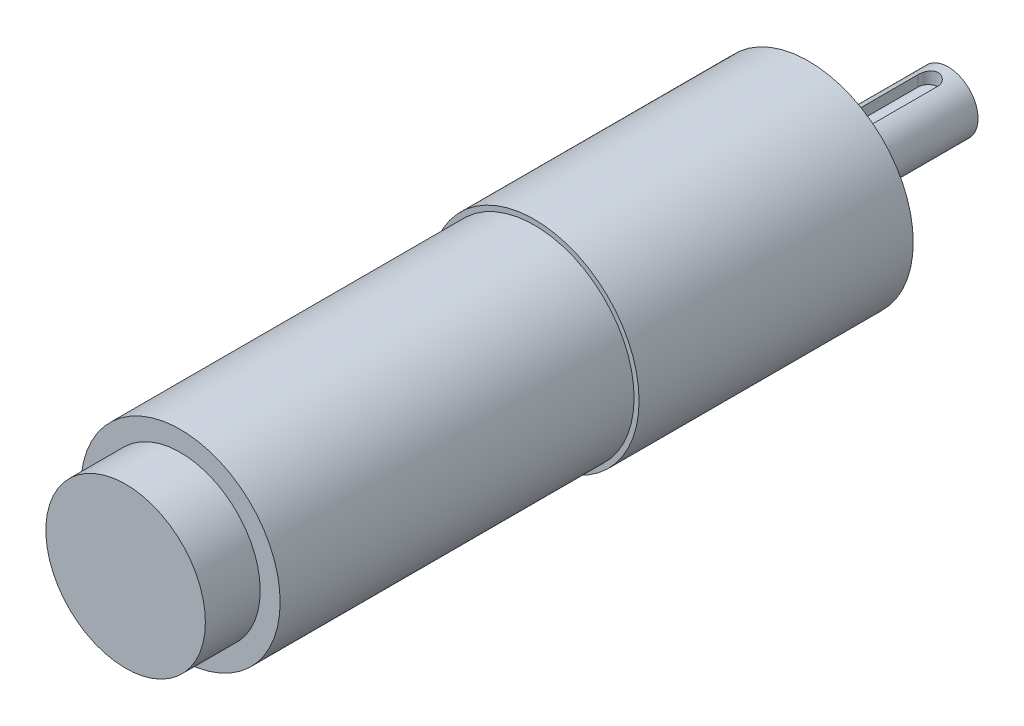
ISO-10303-21;
HEADER;
FILE_DESCRIPTION(('STEP AP214'),'2;1');
FILE_NAME('part.step','',(''),(''),'','','');
FILE_SCHEMA(('AUTOMOTIVE_DESIGN { 1 0 10303 214 1 1 1 1 }'));
ENDSEC;
DATA;
#1=APPLICATION_CONTEXT('core data for automotive mechanical design processes');
#2=APPLICATION_PROTOCOL_DEFINITION('international standard','automotive_design',2000,#1);
#3=PRODUCT_CONTEXT('',#1,'mechanical');
#4=PRODUCT('Part','Part','',(#3));
#5=PRODUCT_RELATED_PRODUCT_CATEGORY('part','',(#4));
#6=PRODUCT_DEFINITION_FORMATION('','',#4);
#7=PRODUCT_DEFINITION_CONTEXT('part definition',#1,'design');
#8=PRODUCT_DEFINITION('design','',#6,#7);
#9=PRODUCT_DEFINITION_SHAPE('','',#8);
#10=(LENGTH_UNIT() NAMED_UNIT(*) SI_UNIT(.MILLI.,.METRE.));
#11=(NAMED_UNIT(*) PLANE_ANGLE_UNIT() SI_UNIT($,.RADIAN.));
#12=(NAMED_UNIT(*) SI_UNIT($,.STERADIAN.) SOLID_ANGLE_UNIT());
#13=UNCERTAINTY_MEASURE_WITH_UNIT(LENGTH_MEASURE(1.E-05),#10,'distance_accuracy_value','');
#14=(GEOMETRIC_REPRESENTATION_CONTEXT(3) GLOBAL_UNCERTAINTY_ASSIGNED_CONTEXT((#13)) GLOBAL_UNIT_ASSIGNED_CONTEXT((#10,
#11,#12)) REPRESENTATION_CONTEXT('',''));
#15=CARTESIAN_POINT('',(0.,0.,0.));
#16=DIRECTION('',(0.,0.,1.));
#17=DIRECTION('',(1.,0.,0.));
#18=AXIS2_PLACEMENT_3D('',#15,#16,#17);
#19=CARTESIAN_POINT('',(0.,0.,-28.));
#20=DIRECTION('',(0.,0.,1.));
#21=DIRECTION('',(1.,0.,0.));
#22=AXIS2_PLACEMENT_3D('',#19,#20,#21);
#23=CYLINDRICAL_SURFACE('',#22,6.);
#24=DIRECTION('',(0.,0.,1.));
#25=VECTOR('',#24,1.);
#26=CARTESIAN_POINT('',(2.,5.65685424949238,-28.));
#27=LINE('',#26,#25);
#28=CARTESIAN_POINT('',(2.,5.65685424949238,-24.));
#29=VERTEX_POINT('',#28);
#30=CARTESIAN_POINT('',(2.,5.65685424949238,-8.));
#31=VERTEX_POINT('',#30);
#32=EDGE_CURVE('E12',#29,#31,#27,.T.);
#33=ORIENTED_EDGE('',*,*,#32,.T.);
#34=CARTESIAN_POINT('',(2.,5.65685424949238,-8.));
#35=CARTESIAN_POINT('',(2.0000014949184,5.65684884188678,-7.94541900639777));
#36=CARTESIAN_POINT('',(1.99776424917479,5.6576451988649,-7.89086587562134));
#37=CARTESIAN_POINT('',(1.9888512140728,5.66078654578442,-7.78218283189021));
#38=CARTESIAN_POINT('',(1.98217662286705,5.66313111768244,-7.72805280868061));
#39=CARTESIAN_POINT('',(1.95562135046158,5.67238184449302,-7.56721571360973));
#40=CARTESIAN_POINT('',(1.92920846605623,5.6815058499903,-7.46163830745904));
#41=CARTESIAN_POINT('',(1.85991682366086,5.70456149397718,-7.25674961511244));
#42=CARTESIAN_POINT('',(1.81704715197507,5.71849047905858,-7.15743490625415));
#43=CARTESIAN_POINT('',(1.71614645792974,5.74957574438921,-6.96732033198908));
#44=CARTESIAN_POINT('',(1.65810612564547,5.76673400456216,-6.87652574186531));
#45=CARTESIAN_POINT('',(1.52610278704603,5.80308960804095,-6.70255953735094));
#46=CARTESIAN_POINT('',(1.45164996064408,5.82233755536618,-6.61977023907478));
#47=CARTESIAN_POINT('',(1.28997688598297,5.86027697385956,-6.46758796441661));
#48=CARTESIAN_POINT('',(1.20275436910907,5.87896834543706,-6.39819737348812));
#49=CARTESIAN_POINT('',(1.01520729191253,5.91427765988454,-6.27304096239161));
#50=CARTESIAN_POINT('',(0.914600178716995,5.93082875123708,-6.21767803119549));
#51=CARTESIAN_POINT('',(0.70485849993172,5.95939217209317,-6.12481549662547));
#52=CARTESIAN_POINT('',(0.595726551186842,5.97140588786619,-6.08731043635913));
#53=CARTESIAN_POINT('',(0.376058690956075,5.98918142285845,-6.03252854781725));
#54=CARTESIAN_POINT('',(0.265703668920225,5.99514617977147,-6.01459345489264));
#55=CARTESIAN_POINT('',(0.043397938911347,6.00087216807634,-5.99736740294878));
#56=CARTESIAN_POINT('',(-0.068552382490784,6.00063487762605,-5.9980720014605));
#57=CARTESIAN_POINT('',(-0.286207690558784,5.99412077270532,-6.01768856621331));
#58=CARTESIAN_POINT('',(-0.391985405251072,5.98808121982527,-6.03588527591893));
#59=CARTESIAN_POINT('',(-0.598888128753311,5.97093921001647,-6.08878639734824));
#60=CARTESIAN_POINT('',(-0.700012879232927,5.95983647235462,-6.12349172441251));
#61=CARTESIAN_POINT('',(-0.896305246061924,5.93351336542608,-6.20884273920126));
#62=CARTESIAN_POINT('',(-0.991377011307983,5.91824075676625,-6.25969209024468));
#63=CARTESIAN_POINT('',(-1.17184917819498,5.88516775360088,-6.3757199027814));
#64=CARTESIAN_POINT('',(-1.25724693942937,5.86736667195186,-6.44090226209303));
#65=CARTESIAN_POINT('',(-1.42019467942242,5.83012543885479,-6.58734209999369));
#66=CARTESIAN_POINT('',(-1.4971872232254,5.81064757359828,-6.66921108721941));
#67=CARTESIAN_POINT('',(-1.63654404964077,5.77294980945702,-6.84488297943233));
#68=CARTESIAN_POINT('',(-1.69890360636762,5.75473031831506,-6.93868972480648));
#69=CARTESIAN_POINT('',(-1.80800665118557,5.72140062752635,-7.13736035670656));
#70=CARTESIAN_POINT('',(-1.85450601901536,5.70634029896469,-7.24236702986588));
#71=CARTESIAN_POINT('',(-1.92892046140223,5.68162194124078,-7.45929395517991));
#72=CARTESIAN_POINT('',(-1.95686487211071,5.67195538817986,-7.5712029867443));
#73=CARTESIAN_POINT('',(-1.98331631256166,5.6627308418944,-7.73683727349596));
#74=CARTESIAN_POINT('',(-1.98957012251023,5.66053335389204,-7.78928277970845));
#75=CARTESIAN_POINT('',(-1.99790923214239,5.65759407142798,-7.89447615679962));
#76=CARTESIAN_POINT('',(-1.99999991078996,5.65685039859056,-7.9472235490888));
#77=CARTESIAN_POINT('',(-2.,5.65685424949238,-8.));
#78=B_SPLINE_CURVE_WITH_KNOTS('',3,(#34,#35,#36,#37,#38,#39,#40,#41,#42,#43,#44,#45,#46,#47,#48,
#49,#50,#51,#52,#53,#54,#55,#56,#57,#58,#59,#60,#61,#62,#63,#64,#65,#66,#67,#68,#69,#70,#71,#72,
#73,#74,#75,#76,#77),.UNSPECIFIED.,.F.,.F.,(4,2,2,2,2,2,2,2,2,2,2,2,2,2,2,2,2,2,2,2,2,4),(0.,
0.163636969470865,0.327229772338923,0.653162396790745,0.978915321932473,1.30486862627062,
1.64233009925355,1.97985159727495,2.32618265866202,2.67240782242254,3.00658941454806,
3.34069136061285,3.6616883693147,3.98270317816496,4.30794037651935,4.63326613177537,
4.973881081161,5.31460588498484,5.6603605985608,6.00556734973678,6.16399790665502,
6.32222363058113),.UNSPECIFIED.);
#79=CARTESIAN_POINT('',(-2.,5.65685424949238,-8.));
#80=VERTEX_POINT('',#79);
#81=EDGE_CURVE('E139',#31,#80,#78,.T.);
#82=ORIENTED_EDGE('',*,*,#81,.T.);
#83=DIRECTION('',(0.,0.,1.));
#84=VECTOR('',#83,1.);
#85=CARTESIAN_POINT('',(-2.,5.65685424949238,-28.));
#86=LINE('',#85,#84);
#87=CARTESIAN_POINT('',(-2.,5.65685424949238,-24.));
#88=VERTEX_POINT('',#87);
#89=EDGE_CURVE('E57',#80,#88,#86,.F.);
#90=ORIENTED_EDGE('',*,*,#89,.T.);
#91=CARTESIAN_POINT('',(-2.,5.65685424949238,-24.));
#92=CARTESIAN_POINT('',(-2.0000014949184,5.65684884188678,-24.0545809936022));
#93=CARTESIAN_POINT('',(-1.99776424917479,5.6576451988649,-24.1091341243787));
#94=CARTESIAN_POINT('',(-1.98885121407281,5.66078654578442,-24.2178171681098));
#95=CARTESIAN_POINT('',(-1.98217662286705,5.66313111768244,-24.2719471913194));
#96=CARTESIAN_POINT('',(-1.95562135046158,5.67238184449302,-24.4327842863903));
#97=CARTESIAN_POINT('',(-1.92920846605623,5.6815058499903,-24.538361692541));
#98=CARTESIAN_POINT('',(-1.85991682366086,5.70456149397718,-24.7432503848876));
#99=CARTESIAN_POINT('',(-1.81704715197507,5.71849047905858,-24.8425650937458));
#100=CARTESIAN_POINT('',(-1.71614645792974,5.74957574438921,-25.0326796680109));
#101=CARTESIAN_POINT('',(-1.65810612564547,5.76673400456216,-25.1234742581347));
#102=CARTESIAN_POINT('',(-1.52610278704603,5.80308960804095,-25.2974404626491));
#103=CARTESIAN_POINT('',(-1.45164996064408,5.82233755536618,-25.3802297609252));
#104=CARTESIAN_POINT('',(-1.28997688598297,5.86027697385956,-25.5324120355834));
#105=CARTESIAN_POINT('',(-1.20275436910908,5.87896834543705,-25.6018026265119));
#106=CARTESIAN_POINT('',(-1.01520729191253,5.91427765988454,-25.7269590376084));
#107=CARTESIAN_POINT('',(-0.914600178716997,5.93082875123708,-25.7823219688045));
#108=CARTESIAN_POINT('',(-0.704858499931722,5.95939217209317,-25.8751845033745));
#109=CARTESIAN_POINT('',(-0.595726551186844,5.97140588786619,-25.9126895636409));
#110=CARTESIAN_POINT('',(-0.376058690956077,5.98918142285845,-25.9674714521827));
#111=CARTESIAN_POINT('',(-0.265703668920227,5.99514617977147,-25.9854065451074));
#112=CARTESIAN_POINT('',(-0.0433979389113499,6.00087216807634,-26.0026325970512));
#113=CARTESIAN_POINT('',(0.0685523824907805,6.00063487762605,-26.0019279985395));
#114=CARTESIAN_POINT('',(0.28620769055878,5.99412077270532,-25.9823114337867));
#115=CARTESIAN_POINT('',(0.391985405251068,5.98808121982527,-25.9641147240811));
#116=CARTESIAN_POINT('',(0.598888128753307,5.97093921001647,-25.9112136026518));
#117=CARTESIAN_POINT('',(0.700012879232924,5.95983647235462,-25.8765082755875));
#118=CARTESIAN_POINT('',(0.896305246061921,5.93351336542609,-25.7911572607987));
#119=CARTESIAN_POINT('',(0.99137701130798,5.91824075676625,-25.7403079097553));
#120=CARTESIAN_POINT('',(1.17184917819497,5.88516775360088,-25.6242800972186));
#121=CARTESIAN_POINT('',(1.25724693942937,5.86736667195186,-25.559097737907));
#122=CARTESIAN_POINT('',(1.42019467942242,5.83012543885479,-25.4126579000063));
#123=CARTESIAN_POINT('',(1.49718722322539,5.81064757359828,-25.3307889127806));
#124=CARTESIAN_POINT('',(1.63654404964076,5.77294980945703,-25.1551170205677));
#125=CARTESIAN_POINT('',(1.69890360636762,5.75473031831506,-25.0613102751935));
#126=CARTESIAN_POINT('',(1.80800665118556,5.72140062752635,-24.8626396432934));
#127=CARTESIAN_POINT('',(1.85450601901536,5.70634029896469,-24.7576329701341));
#128=CARTESIAN_POINT('',(1.92892046140223,5.68162194124078,-24.5407060448201));
#129=CARTESIAN_POINT('',(1.95686487211071,5.67195538817986,-24.4287970132557));
#130=CARTESIAN_POINT('',(1.98331631256165,5.6627308418944,-24.263162726504));
#131=CARTESIAN_POINT('',(1.98957012251023,5.66053335389204,-24.2107172202915));
#132=CARTESIAN_POINT('',(1.99790923214239,5.65759407142798,-24.1055238432004));
#133=CARTESIAN_POINT('',(1.99999991078995,5.65685039859056,-24.0527764509112));
#134=CARTESIAN_POINT('',(2.,5.65685424949238,-24.));
#135=B_SPLINE_CURVE_WITH_KNOTS('',3,(#91,#92,#93,#94,#95,#96,#97,#98,#99,#100,#101,#102,#103,
#104,#105,#106,#107,#108,#109,#110,#111,#112,#113,#114,#115,#116,#117,#118,#119,#120,#121,#122,
#123,#124,#125,#126,#127,#128,#129,#130,#131,#132,#133,#134),.UNSPECIFIED.,.F.,.F.,(4,2,2,2,2,2,
2,2,2,2,2,2,2,2,2,2,2,2,2,2,2,4),(0.,0.163636969470864,0.327229772338923,0.653162396790745,
0.978915321932474,1.30486862627062,1.64233009925355,1.97985159727495,2.32618265866202,
2.67240782242255,3.00658941454806,3.34069136061284,3.6616883693147,3.98270317816496,
4.30794037651935,4.63326613177537,4.973881081161,5.31460588498485,5.6603605985608,
6.00556734973678,6.16399790665503,6.32222363058113),.UNSPECIFIED.);
#136=EDGE_CURVE('E67',#88,#29,#135,.T.);
#137=ORIENTED_EDGE('',*,*,#136,.T.);
#138=EDGE_LOOP('',(#33,#82,#90,#137));
#139=FACE_BOUND('',#138,.T.);
#140=CARTESIAN_POINT('',(0.,0.,-28.));
#141=DIRECTION('',(0.,0.,-1.));
#142=DIRECTION('',(-1.,0.,0.));
#143=AXIS2_PLACEMENT_3D('',#140,#141,#142);
#144=CIRCLE('',#143,6.);
#145=CARTESIAN_POINT('',(-6.,0.,-28.));
#146=VERTEX_POINT('',#145);
#147=EDGE_CURVE('E135',#146,#146,#144,.T.);
#148=ORIENTED_EDGE('',*,*,#147,.F.);
#149=EDGE_LOOP('',(#148));
#150=FACE_BOUND('',#149,.T.);
#151=CARTESIAN_POINT('',(0.,0.,-3.));
#152=DIRECTION('',(0.,0.,-1.));
#153=DIRECTION('',(-1.,0.,0.));
#154=AXIS2_PLACEMENT_3D('',#151,#152,#153);
#155=CIRCLE('',#154,6.);
#156=CARTESIAN_POINT('',(-6.,0.,-3.));
#157=VERTEX_POINT('',#156);
#158=EDGE_CURVE('E129',#157,#157,#155,.T.);
#159=ORIENTED_EDGE('',*,*,#158,.T.);
#160=EDGE_LOOP('',(#159));
#161=FACE_BOUND('',#160,.T.);
#162=ADVANCED_FACE('F48',(#139,#150,#161),#23,.T.);
#163=CARTESIAN_POINT('',(0.,0.,-28.));
#164=DIRECTION('',(0.,0.,-1.));
#165=DIRECTION('',(-1.,0.,0.));
#166=AXIS2_PLACEMENT_3D('',#163,#164,#165);
#167=PLANE('',#166);
#168=ORIENTED_EDGE('',*,*,#147,.T.);
#169=EDGE_LOOP('',(#168));
#170=FACE_BOUND('',#169,.T.);
#171=ADVANCED_FACE('F167',(#170),#167,.T.);
#172=CARTESIAN_POINT('',(0.,0.,-3.));
#173=DIRECTION('',(0.,0.,-1.));
#174=DIRECTION('',(-1.,0.,0.));
#175=AXIS2_PLACEMENT_3D('',#172,#173,#174);
#176=PLANE('',#175);
#177=ORIENTED_EDGE('',*,*,#158,.F.);
#178=EDGE_LOOP('',(#177));
#179=FACE_BOUND('',#178,.T.);
#180=ADVANCED_FACE('F166',(#179),#176,.F.);
#181=CARTESIAN_POINT('',(0.,3.5,-24.));
#182=DIRECTION('',(0.,1.,0.));
#183=DIRECTION('',(0.,0.,1.));
#184=AXIS2_PLACEMENT_3D('',#181,#182,#183);
#185=CYLINDRICAL_SURFACE('',#184,2.);
#186=DIRECTION('',(0.,1.,0.));
#187=VECTOR('',#186,1.);
#188=CARTESIAN_POINT('',(-2.,3.5,-24.));
#189=LINE('',#188,#187);
#190=CARTESIAN_POINT('',(-2.,3.5,-24.));
#191=VERTEX_POINT('',#190);
#192=EDGE_CURVE('E95',#191,#88,#189,.T.);
#193=ORIENTED_EDGE('',*,*,#192,.F.);
#194=CARTESIAN_POINT('',(0.,3.5,-24.));
#195=DIRECTION('',(0.,1.,0.));
#196=DIRECTION('',(0.,0.,1.));
#197=AXIS2_PLACEMENT_3D('',#194,#195,#196);
#198=CIRCLE('',#197,2.);
#199=CARTESIAN_POINT('',(2.,3.5,-24.));
#200=VERTEX_POINT('',#199);
#201=EDGE_CURVE('E99',#200,#191,#198,.T.);
#202=ORIENTED_EDGE('',*,*,#201,.F.);
#203=DIRECTION('',(0.,1.,0.));
#204=VECTOR('',#203,1.);
#205=CARTESIAN_POINT('',(2.,3.5,-24.));
#206=LINE('',#205,#204);
#207=EDGE_CURVE('E127',#200,#29,#206,.T.);
#208=ORIENTED_EDGE('',*,*,#207,.T.);
#209=ORIENTED_EDGE('',*,*,#136,.F.);
#210=EDGE_LOOP('',(#193,#202,#208,#209));
#211=FACE_BOUND('',#210,.T.);
#212=ADVANCED_FACE('F97',(#211),#185,.F.);
#213=CARTESIAN_POINT('',(2.,3.5,-24.));
#214=DIRECTION('',(1.,0.,0.));
#215=DIRECTION('',(0.,0.,-1.));
#216=AXIS2_PLACEMENT_3D('',#213,#214,#215);
#217=PLANE('',#216);
#218=ORIENTED_EDGE('',*,*,#207,.F.);
#219=DIRECTION('',(0.,0.,-1.));
#220=VECTOR('',#219,1.);
#221=CARTESIAN_POINT('',(2.,3.5,-24.));
#222=LINE('',#221,#220);
#223=CARTESIAN_POINT('',(2.,3.5,-8.));
#224=VERTEX_POINT('',#223);
#225=EDGE_CURVE('E105',#224,#200,#222,.T.);
#226=ORIENTED_EDGE('',*,*,#225,.F.);
#227=DIRECTION('',(0.,1.,0.));
#228=VECTOR('',#227,1.);
#229=CARTESIAN_POINT('',(2.,3.5,-8.));
#230=LINE('',#229,#228);
#231=EDGE_CURVE('E130',#224,#31,#230,.T.);
#232=ORIENTED_EDGE('',*,*,#231,.T.);
#233=ORIENTED_EDGE('',*,*,#32,.F.);
#234=EDGE_LOOP('',(#218,#226,#232,#233));
#235=FACE_BOUND('',#234,.T.);
#236=ADVANCED_FACE('F159',(#235),#217,.F.);
#237=CARTESIAN_POINT('',(0.,3.5,-8.));
#238=DIRECTION('',(0.,1.,0.));
#239=DIRECTION('',(0.,0.,1.));
#240=AXIS2_PLACEMENT_3D('',#237,#238,#239);
#241=CYLINDRICAL_SURFACE('',#240,2.);
#242=ORIENTED_EDGE('',*,*,#231,.F.);
#243=CARTESIAN_POINT('',(0.,3.5,-8.));
#244=DIRECTION('',(0.,1.,0.));
#245=DIRECTION('',(0.,0.,1.));
#246=AXIS2_PLACEMENT_3D('',#243,#244,#245);
#247=CIRCLE('',#246,2.);
#248=CARTESIAN_POINT('',(-2.,3.5,-8.));
#249=VERTEX_POINT('',#248);
#250=EDGE_CURVE('E115',#249,#224,#247,.T.);
#251=ORIENTED_EDGE('',*,*,#250,.F.);
#252=DIRECTION('',(0.,1.,0.));
#253=VECTOR('',#252,1.);
#254=CARTESIAN_POINT('',(-2.,3.5,-8.));
#255=LINE('',#254,#253);
#256=EDGE_CURVE('E104',#249,#80,#255,.T.);
#257=ORIENTED_EDGE('',*,*,#256,.T.);
#258=ORIENTED_EDGE('',*,*,#81,.F.);
#259=EDGE_LOOP('',(#242,#251,#257,#258));
#260=FACE_BOUND('',#259,.T.);
#261=ADVANCED_FACE('F154',(#260),#241,.F.);
#262=CARTESIAN_POINT('',(-2.,3.5,-24.));
#263=DIRECTION('',(-1.,0.,0.));
#264=DIRECTION('',(0.,0.,1.));
#265=AXIS2_PLACEMENT_3D('',#262,#263,#264);
#266=PLANE('',#265);
#267=ORIENTED_EDGE('',*,*,#256,.F.);
#268=DIRECTION('',(0.,0.,1.));
#269=VECTOR('',#268,1.);
#270=CARTESIAN_POINT('',(-2.,3.5,-24.));
#271=LINE('',#270,#269);
#272=EDGE_CURVE('E108',#191,#249,#271,.T.);
#273=ORIENTED_EDGE('',*,*,#272,.F.);
#274=ORIENTED_EDGE('',*,*,#192,.T.);
#275=ORIENTED_EDGE('',*,*,#89,.F.);
#276=EDGE_LOOP('',(#267,#273,#274,#275));
#277=FACE_BOUND('',#276,.T.);
#278=ADVANCED_FACE('F109',(#277),#266,.F.);
#279=CARTESIAN_POINT('',(0.,3.5,-24.));
#280=DIRECTION('',(0.,1.,0.));
#281=DIRECTION('',(0.,0.,1.));
#282=AXIS2_PLACEMENT_3D('',#279,#280,#281);
#283=PLANE('',#282);
#284=ORIENTED_EDGE('',*,*,#201,.T.);
#285=ORIENTED_EDGE('',*,*,#272,.T.);
#286=ORIENTED_EDGE('',*,*,#250,.T.);
#287=ORIENTED_EDGE('',*,*,#225,.T.);
#288=EDGE_LOOP('',(#284,#285,#286,#287));
#289=FACE_BOUND('',#288,.T.);
#290=ADVANCED_FACE('F117',(#289),#283,.T.);
#291=CLOSED_SHELL('',(#162,#171,#180,#212,#236,#261,#278,#290));
#292=MANIFOLD_SOLID_BREP('B2',#291);
#293=CARTESIAN_POINT('',(0.,0.,0.));
#294=DIRECTION('',(0.,0.,1.));
#295=DIRECTION('',(1.,0.,0.));
#296=AXIS2_PLACEMENT_3D('',#293,#294,#295);
#297=PLANE('',#296);
#298=CARTESIAN_POINT('',(0.,0.,0.));
#299=DIRECTION('',(0.,0.,1.));
#300=DIRECTION('',(1.,0.,0.));
#301=AXIS2_PLACEMENT_3D('',#298,#299,#300);
#302=CIRCLE('',#301,21.);
#303=CARTESIAN_POINT('',(21.,0.,0.));
#304=VERTEX_POINT('',#303);
#305=EDGE_CURVE('E249',#304,#304,#302,.T.);
#306=ORIENTED_EDGE('',*,*,#305,.F.);
#307=EDGE_LOOP('',(#306));
#308=FACE_BOUND('',#307,.T.);
#309=CARTESIAN_POINT('',(0.,0.,0.));
#310=DIRECTION('',(0.,0.,1.));
#311=DIRECTION('',(1.,0.,0.));
#312=AXIS2_PLACEMENT_3D('',#309,#310,#311);
#313=CIRCLE('',#312,14.);
#314=CARTESIAN_POINT('',(14.,0.,0.));
#315=VERTEX_POINT('',#314);
#316=EDGE_CURVE('E47',#315,#315,#313,.F.);
#317=ORIENTED_EDGE('',*,*,#316,.F.);
#318=EDGE_LOOP('',(#317));
#319=FACE_BOUND('',#318,.T.);
#320=ADVANCED_FACE('F234',(#308,#319),#297,.F.);
#321=CARTESIAN_POINT('',(0.,0.,126.));
#322=DIRECTION('',(0.,0.,1.));
#323=DIRECTION('',(1.,0.,0.));
#324=AXIS2_PLACEMENT_3D('',#321,#322,#323);
#325=PLANE('',#324);
#326=CARTESIAN_POINT('',(0.,0.,126.));
#327=DIRECTION('',(0.,0.,1.));
#328=DIRECTION('',(1.,0.,0.));
#329=AXIS2_PLACEMENT_3D('',#326,#327,#328);
#330=CIRCLE('',#329,20.);
#331=CARTESIAN_POINT('',(20.,0.,126.));
#332=VERTEX_POINT('',#331);
#333=EDGE_CURVE('E256',#332,#332,#330,.T.);
#334=ORIENTED_EDGE('',*,*,#333,.T.);
#335=EDGE_LOOP('',(#334));
#336=FACE_BOUND('',#335,.T.);
#337=CARTESIAN_POINT('',(0.,0.,126.));
#338=DIRECTION('',(0.,0.,1.));
#339=DIRECTION('',(1.,0.,0.));
#340=AXIS2_PLACEMENT_3D('',#337,#338,#339);
#341=CIRCLE('',#340,16.);
#342=CARTESIAN_POINT('',(16.,0.,126.));
#343=VERTEX_POINT('',#342);
#344=EDGE_CURVE('E265',#343,#343,#341,.T.);
#345=ORIENTED_EDGE('',*,*,#344,.F.);
#346=EDGE_LOOP('',(#345));
#347=FACE_BOUND('',#346,.T.);
#348=ADVANCED_FACE('F289',(#336,#347),#325,.T.);
#349=CARTESIAN_POINT('',(0.,0.,55.));
#350=DIRECTION('',(0.,0.,1.));
#351=DIRECTION('',(1.,0.,0.));
#352=AXIS2_PLACEMENT_3D('',#349,#350,#351);
#353=PLANE('',#352);
#354=CARTESIAN_POINT('',(0.,0.,55.));
#355=DIRECTION('',(0.,0.,1.));
#356=DIRECTION('',(1.,0.,0.));
#357=AXIS2_PLACEMENT_3D('',#354,#355,#356);
#358=CIRCLE('',#357,21.);
#359=CARTESIAN_POINT('',(21.,0.,55.));
#360=VERTEX_POINT('',#359);
#361=EDGE_CURVE('E242',#360,#360,#358,.T.);
#362=ORIENTED_EDGE('',*,*,#361,.T.);
#363=EDGE_LOOP('',(#362));
#364=FACE_BOUND('',#363,.T.);
#365=CARTESIAN_POINT('',(0.,0.,55.));
#366=DIRECTION('',(0.,0.,1.));
#367=DIRECTION('',(1.,0.,0.));
#368=AXIS2_PLACEMENT_3D('',#365,#366,#367);
#369=CIRCLE('',#368,20.);
#370=CARTESIAN_POINT('',(20.,0.,55.));
#371=VERTEX_POINT('',#370);
#372=EDGE_CURVE('E258',#371,#371,#369,.T.);
#373=ORIENTED_EDGE('',*,*,#372,.F.);
#374=EDGE_LOOP('',(#373));
#375=FACE_BOUND('',#374,.T.);
#376=ADVANCED_FACE('F294',(#364,#375),#353,.T.);
#377=CARTESIAN_POINT('',(0.,0.,55.));
#378=DIRECTION('',(0.,0.,-1.));
#379=DIRECTION('',(-1.,0.,0.));
#380=AXIS2_PLACEMENT_3D('',#377,#378,#379);
#381=CYLINDRICAL_SURFACE('',#380,21.);
#382=ORIENTED_EDGE('',*,*,#361,.F.);
#383=EDGE_LOOP('',(#382));
#384=FACE_BOUND('',#383,.T.);
#385=ORIENTED_EDGE('',*,*,#305,.T.);
#386=EDGE_LOOP('',(#385));
#387=FACE_BOUND('',#386,.T.);
#388=ADVANCED_FACE('F236',(#384,#387),#381,.T.);
#389=CARTESIAN_POINT('',(0.,0.,126.));
#390=DIRECTION('',(0.,0.,-1.));
#391=DIRECTION('',(-1.,0.,0.));
#392=AXIS2_PLACEMENT_3D('',#389,#390,#391);
#393=CYLINDRICAL_SURFACE('',#392,20.);
#394=ORIENTED_EDGE('',*,*,#333,.F.);
#395=EDGE_LOOP('',(#394));
#396=FACE_BOUND('',#395,.T.);
#397=ORIENTED_EDGE('',*,*,#372,.T.);
#398=EDGE_LOOP('',(#397));
#399=FACE_BOUND('',#398,.T.);
#400=ADVANCED_FACE('F302',(#396,#399),#393,.T.);
#401=CARTESIAN_POINT('',(0.,0.,137.));
#402=DIRECTION('',(0.,0.,-1.));
#403=DIRECTION('',(-1.,0.,0.));
#404=AXIS2_PLACEMENT_3D('',#401,#402,#403);
#405=CYLINDRICAL_SURFACE('',#404,16.);
#406=CARTESIAN_POINT('',(0.,0.,137.));
#407=DIRECTION('',(0.,0.,1.));
#408=DIRECTION('',(1.,0.,0.));
#409=AXIS2_PLACEMENT_3D('',#406,#407,#408);
#410=CIRCLE('',#409,16.);
#411=CARTESIAN_POINT('',(16.,0.,137.));
#412=VERTEX_POINT('',#411);
#413=EDGE_CURVE('E261',#412,#412,#410,.T.);
#414=ORIENTED_EDGE('',*,*,#413,.F.);
#415=EDGE_LOOP('',(#414));
#416=FACE_BOUND('',#415,.T.);
#417=ORIENTED_EDGE('',*,*,#344,.T.);
#418=EDGE_LOOP('',(#417));
#419=FACE_BOUND('',#418,.T.);
#420=ADVANCED_FACE('F285',(#416,#419),#405,.T.);
#421=CARTESIAN_POINT('',(0.,0.,137.));
#422=DIRECTION('',(0.,0.,1.));
#423=DIRECTION('',(1.,0.,0.));
#424=AXIS2_PLACEMENT_3D('',#421,#422,#423);
#425=PLANE('',#424);
#426=ORIENTED_EDGE('',*,*,#413,.T.);
#427=EDGE_LOOP('',(#426));
#428=FACE_BOUND('',#427,.T.);
#429=ADVANCED_FACE('F278',(#428),#425,.T.);
#430=CARTESIAN_POINT('',(0.,0.,-3.));
#431=DIRECTION('',(0.,0.,1.));
#432=DIRECTION('',(1.,0.,0.));
#433=AXIS2_PLACEMENT_3D('',#430,#431,#432);
#434=CYLINDRICAL_SURFACE('',#433,14.);
#435=CARTESIAN_POINT('',(0.,0.,-3.));
#436=DIRECTION('',(0.,0.,-1.));
#437=DIRECTION('',(-1.,0.,0.));
#438=AXIS2_PLACEMENT_3D('',#435,#436,#437);
#439=CIRCLE('',#438,14.);
#440=CARTESIAN_POINT('',(-14.,0.,-3.));
#441=VERTEX_POINT('',#440);
#442=EDGE_CURVE('E268',#441,#441,#439,.T.);
#443=ORIENTED_EDGE('',*,*,#442,.F.);
#444=EDGE_LOOP('',(#443));
#445=FACE_BOUND('',#444,.T.);
#446=ORIENTED_EDGE('',*,*,#316,.T.);
#447=EDGE_LOOP('',(#446));
#448=FACE_BOUND('',#447,.T.);
#449=ADVANCED_FACE('F276',(#445,#448),#434,.T.);
#450=CARTESIAN_POINT('',(0.,0.,-3.));
#451=DIRECTION('',(0.,0.,-1.));
#452=DIRECTION('',(-1.,0.,0.));
#453=AXIS2_PLACEMENT_3D('',#450,#451,#452);
#454=PLANE('',#453);
#455=ORIENTED_EDGE('',*,*,#442,.T.);
#456=EDGE_LOOP('',(#455));
#457=FACE_BOUND('',#456,.T.);
#458=ADVANCED_FACE('F274',(#457),#454,.T.);
#459=CLOSED_SHELL('',(#320,#348,#376,#388,#400,#420,#429,#449,#458));
#460=MANIFOLD_SOLID_BREP('B6',#459);
#461=ADVANCED_BREP_SHAPE_REPRESENTATION('',(#18,#292,#460),#14);
#462=SHAPE_DEFINITION_REPRESENTATION(#9,#461);
ENDSEC;
END-ISO-10303-21;
